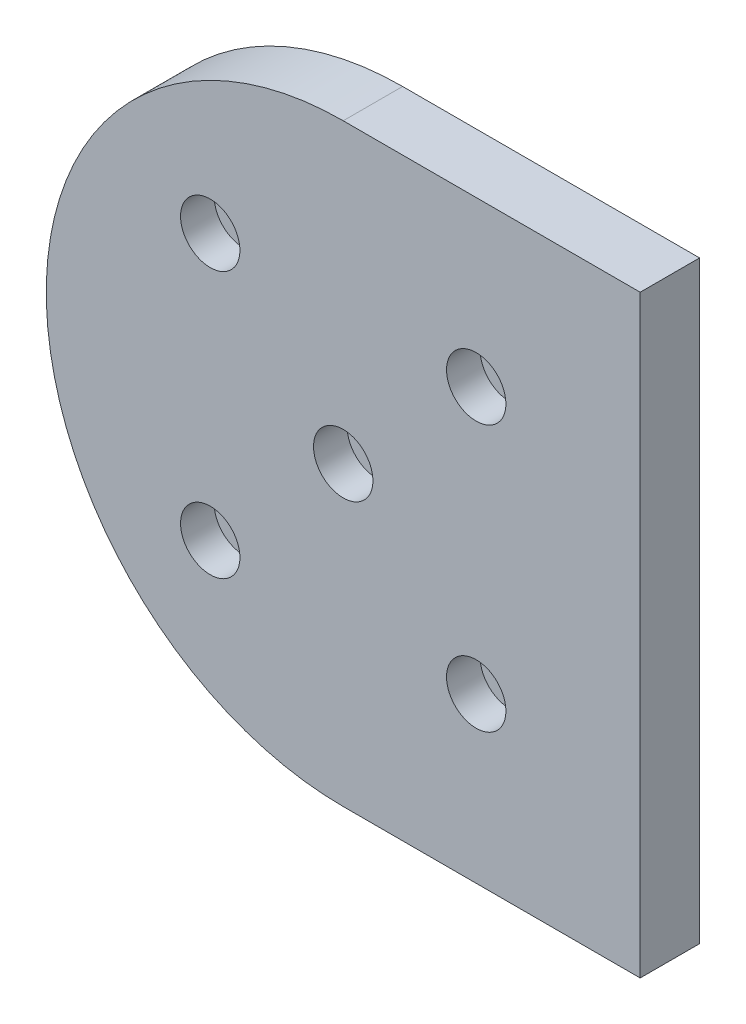
ISO-10303-21;
HEADER;
FILE_DESCRIPTION(('STEP AP214'),'2;1');
FILE_NAME('part.step','',(''),(''),'','','');
FILE_SCHEMA(('AUTOMOTIVE_DESIGN { 1 0 10303 214 1 1 1 1 }'));
ENDSEC;
DATA;
#1=APPLICATION_CONTEXT('core data for automotive mechanical design processes');
#2=APPLICATION_PROTOCOL_DEFINITION('international standard','automotive_design',2000,#1);
#3=PRODUCT_CONTEXT('',#1,'mechanical');
#4=PRODUCT('Part','Part','',(#3));
#5=PRODUCT_RELATED_PRODUCT_CATEGORY('part','',(#4));
#6=PRODUCT_DEFINITION_FORMATION('','',#4);
#7=PRODUCT_DEFINITION_CONTEXT('part definition',#1,'design');
#8=PRODUCT_DEFINITION('design','',#6,#7);
#9=PRODUCT_DEFINITION_SHAPE('','',#8);
#10=(LENGTH_UNIT() NAMED_UNIT(*) SI_UNIT(.MILLI.,.METRE.));
#11=(NAMED_UNIT(*) PLANE_ANGLE_UNIT() SI_UNIT($,.RADIAN.));
#12=(NAMED_UNIT(*) SI_UNIT($,.STERADIAN.) SOLID_ANGLE_UNIT());
#13=UNCERTAINTY_MEASURE_WITH_UNIT(LENGTH_MEASURE(1.E-05),#10,'distance_accuracy_value','');
#14=(GEOMETRIC_REPRESENTATION_CONTEXT(3) GLOBAL_UNCERTAINTY_ASSIGNED_CONTEXT((#13)) GLOBAL_UNIT_ASSIGNED_CONTEXT((#10,
#11,#12)) REPRESENTATION_CONTEXT('',''));
#15=CARTESIAN_POINT('',(0.,0.,0.));
#16=DIRECTION('',(0.,0.,1.));
#17=DIRECTION('',(1.,0.,0.));
#18=AXIS2_PLACEMENT_3D('',#15,#16,#17);
#19=CARTESIAN_POINT('',(30.,0.,6.));
#20=DIRECTION('',(1.,0.,0.));
#21=DIRECTION('',(0.,0.,-1.));
#22=AXIS2_PLACEMENT_3D('',#19,#20,#21);
#23=PLANE('',#22);
#24=DIRECTION('',(0.,-1.,0.));
#25=VECTOR('',#24,1.);
#26=CARTESIAN_POINT('',(30.,0.,0.));
#27=LINE('',#26,#25);
#28=CARTESIAN_POINT('',(30.,30.,0.));
#29=VERTEX_POINT('',#28);
#30=CARTESIAN_POINT('',(30.,-30.,0.));
#31=VERTEX_POINT('',#30);
#32=EDGE_CURVE('E107',#29,#31,#27,.T.);
#33=ORIENTED_EDGE('',*,*,#32,.F.);
#34=DIRECTION('',(0.,0.,-1.));
#35=VECTOR('',#34,1.);
#36=CARTESIAN_POINT('',(30.,30.,6.));
#37=LINE('',#36,#35);
#38=CARTESIAN_POINT('',(30.,30.,6.));
#39=VERTEX_POINT('',#38);
#40=EDGE_CURVE('E11',#39,#29,#37,.T.);
#41=ORIENTED_EDGE('',*,*,#40,.F.);
#42=DIRECTION('',(0.,-1.,0.));
#43=VECTOR('',#42,1.);
#44=CARTESIAN_POINT('',(30.,0.,6.));
#45=LINE('',#44,#43);
#46=CARTESIAN_POINT('',(30.,-30.,6.));
#47=VERTEX_POINT('',#46);
#48=EDGE_CURVE('E100',#39,#47,#45,.T.);
#49=ORIENTED_EDGE('',*,*,#48,.T.);
#50=DIRECTION('',(0.,0.,-1.));
#51=VECTOR('',#50,1.);
#52=CARTESIAN_POINT('',(30.,-30.,6.));
#53=LINE('',#52,#51);
#54=EDGE_CURVE('E81',#47,#31,#53,.T.);
#55=ORIENTED_EDGE('',*,*,#54,.T.);
#56=EDGE_LOOP('',(#33,#41,#49,#55));
#57=FACE_BOUND('',#56,.T.);
#58=ADVANCED_FACE('F43',(#57),#23,.T.);
#59=CARTESIAN_POINT('',(0.,30.,6.));
#60=DIRECTION('',(0.,1.,0.));
#61=DIRECTION('',(0.,0.,1.));
#62=AXIS2_PLACEMENT_3D('',#59,#60,#61);
#63=PLANE('',#62);
#64=DIRECTION('',(1.,0.,0.));
#65=VECTOR('',#64,1.);
#66=CARTESIAN_POINT('',(0.,30.,0.));
#67=LINE('',#66,#65);
#68=CARTESIAN_POINT('',(0.,30.,0.));
#69=VERTEX_POINT('',#68);
#70=EDGE_CURVE('E94',#69,#29,#67,.T.);
#71=ORIENTED_EDGE('',*,*,#70,.F.);
#72=DIRECTION('',(0.,0.,-1.));
#73=VECTOR('',#72,1.);
#74=CARTESIAN_POINT('',(0.,30.,6.));
#75=LINE('',#74,#73);
#76=CARTESIAN_POINT('',(0.,30.,6.));
#77=VERTEX_POINT('',#76);
#78=EDGE_CURVE('E51',#77,#69,#75,.T.);
#79=ORIENTED_EDGE('',*,*,#78,.F.);
#80=DIRECTION('',(1.,0.,0.));
#81=VECTOR('',#80,1.);
#82=CARTESIAN_POINT('',(0.,30.,6.));
#83=LINE('',#82,#81);
#84=EDGE_CURVE('E92',#77,#39,#83,.T.);
#85=ORIENTED_EDGE('',*,*,#84,.T.);
#86=ORIENTED_EDGE('',*,*,#40,.T.);
#87=EDGE_LOOP('',(#71,#79,#85,#86));
#88=FACE_BOUND('',#87,.T.);
#89=ADVANCED_FACE('F90',(#88),#63,.T.);
#90=CARTESIAN_POINT('',(0.,0.,6.));
#91=DIRECTION('',(0.,0.,-1.));
#92=DIRECTION('',(-1.,0.,0.));
#93=AXIS2_PLACEMENT_3D('',#90,#91,#92);
#94=CYLINDRICAL_SURFACE('',#93,30.);
#95=CARTESIAN_POINT('',(0.,0.,0.));
#96=DIRECTION('',(0.,0.,1.));
#97=DIRECTION('',(1.,0.,0.));
#98=AXIS2_PLACEMENT_3D('',#95,#96,#97);
#99=CIRCLE('',#98,30.);
#100=CARTESIAN_POINT('',(0.,-30.,0.));
#101=VERTEX_POINT('',#100);
#102=EDGE_CURVE('E74',#69,#101,#99,.T.);
#103=ORIENTED_EDGE('',*,*,#102,.T.);
#104=DIRECTION('',(0.,0.,-1.));
#105=VECTOR('',#104,1.);
#106=CARTESIAN_POINT('',(0.,-30.,6.));
#107=LINE('',#106,#105);
#108=CARTESIAN_POINT('',(0.,-30.,6.));
#109=VERTEX_POINT('',#108);
#110=EDGE_CURVE('E95',#109,#101,#107,.T.);
#111=ORIENTED_EDGE('',*,*,#110,.F.);
#112=CARTESIAN_POINT('',(0.,0.,6.));
#113=DIRECTION('',(0.,0.,1.));
#114=DIRECTION('',(1.,0.,0.));
#115=AXIS2_PLACEMENT_3D('',#112,#113,#114);
#116=CIRCLE('',#115,30.);
#117=EDGE_CURVE('E96',#77,#109,#116,.T.);
#118=ORIENTED_EDGE('',*,*,#117,.F.);
#119=ORIENTED_EDGE('',*,*,#78,.T.);
#120=EDGE_LOOP('',(#103,#111,#118,#119));
#121=FACE_BOUND('',#120,.T.);
#122=ADVANCED_FACE('F97',(#121),#94,.T.);
#123=CARTESIAN_POINT('',(0.,-30.,6.));
#124=DIRECTION('',(0.,1.,0.));
#125=DIRECTION('',(0.,0.,1.));
#126=AXIS2_PLACEMENT_3D('',#123,#124,#125);
#127=PLANE('',#126);
#128=DIRECTION('',(1.,0.,0.));
#129=VECTOR('',#128,1.);
#130=CARTESIAN_POINT('',(0.,-30.,0.));
#131=LINE('',#130,#129);
#132=EDGE_CURVE('E102',#101,#31,#131,.T.);
#133=ORIENTED_EDGE('',*,*,#132,.T.);
#134=ORIENTED_EDGE('',*,*,#54,.F.);
#135=DIRECTION('',(1.,0.,0.));
#136=VECTOR('',#135,1.);
#137=CARTESIAN_POINT('',(0.,-30.,6.));
#138=LINE('',#137,#136);
#139=EDGE_CURVE('E59',#109,#47,#138,.T.);
#140=ORIENTED_EDGE('',*,*,#139,.F.);
#141=ORIENTED_EDGE('',*,*,#110,.T.);
#142=EDGE_LOOP('',(#133,#134,#140,#141));
#143=FACE_BOUND('',#142,.T.);
#144=ADVANCED_FACE('F117',(#143),#127,.F.);
#145=CARTESIAN_POINT('',(0.,0.,6.));
#146=DIRECTION('',(0.,0.,1.));
#147=DIRECTION('',(1.,0.,0.));
#148=AXIS2_PLACEMENT_3D('',#145,#146,#147);
#149=PLANE('',#148);
#150=CARTESIAN_POINT('',(0.,0.,6.));
#151=DIRECTION('',(0.,0.,1.));
#152=DIRECTION('',(1.,0.,0.));
#153=AXIS2_PLACEMENT_3D('',#150,#151,#152);
#154=CIRCLE('',#153,3.);
#155=CARTESIAN_POINT('',(3.,0.,6.));
#156=VERTEX_POINT('',#155);
#157=EDGE_CURVE('E212',#156,#156,#154,.T.);
#158=ORIENTED_EDGE('',*,*,#157,.F.);
#159=EDGE_LOOP('',(#158));
#160=FACE_BOUND('',#159,.T.);
#161=CARTESIAN_POINT('',(13.4350288425444,-13.4350288425444,6.));
#162=DIRECTION('',(0.,0.,1.));
#163=DIRECTION('',(1.,0.,0.));
#164=AXIS2_PLACEMENT_3D('',#161,#162,#163);
#165=CIRCLE('',#164,3.);
#166=CARTESIAN_POINT('',(16.4350288425444,-13.4350288425444,6.));
#167=VERTEX_POINT('',#166);
#168=EDGE_CURVE('E222',#167,#167,#165,.T.);
#169=ORIENTED_EDGE('',*,*,#168,.F.);
#170=EDGE_LOOP('',(#169));
#171=FACE_BOUND('',#170,.T.);
#172=CARTESIAN_POINT('',(-13.4350288425444,13.4350288425444,6.));
#173=DIRECTION('',(0.,0.,1.));
#174=DIRECTION('',(1.,0.,0.));
#175=AXIS2_PLACEMENT_3D('',#172,#173,#174);
#176=CIRCLE('',#175,3.);
#177=CARTESIAN_POINT('',(-10.4350288425444,13.4350288425444,6.));
#178=VERTEX_POINT('',#177);
#179=EDGE_CURVE('E234',#178,#178,#176,.T.);
#180=ORIENTED_EDGE('',*,*,#179,.F.);
#181=EDGE_LOOP('',(#180));
#182=FACE_BOUND('',#181,.T.);
#183=CARTESIAN_POINT('',(-13.4350288425444,-13.4350288425444,6.));
#184=DIRECTION('',(0.,0.,1.));
#185=DIRECTION('',(1.,0.,0.));
#186=AXIS2_PLACEMENT_3D('',#183,#184,#185);
#187=CIRCLE('',#186,3.);
#188=CARTESIAN_POINT('',(-10.4350288425444,-13.4350288425444,6.));
#189=VERTEX_POINT('',#188);
#190=EDGE_CURVE('E246',#189,#189,#187,.T.);
#191=ORIENTED_EDGE('',*,*,#190,.F.);
#192=EDGE_LOOP('',(#191));
#193=FACE_BOUND('',#192,.T.);
#194=CARTESIAN_POINT('',(13.4350288425444,13.4350288425444,6.));
#195=DIRECTION('',(0.,0.,1.));
#196=DIRECTION('',(1.,0.,0.));
#197=AXIS2_PLACEMENT_3D('',#194,#195,#196);
#198=CIRCLE('',#197,2.99999999999999);
#199=CARTESIAN_POINT('',(16.4350288425444,13.4350288425444,6.));
#200=VERTEX_POINT('',#199);
#201=EDGE_CURVE('E258',#200,#200,#198,.T.);
#202=ORIENTED_EDGE('',*,*,#201,.F.);
#203=EDGE_LOOP('',(#202));
#204=FACE_BOUND('',#203,.T.);
#205=ORIENTED_EDGE('',*,*,#48,.F.);
#206=ORIENTED_EDGE('',*,*,#84,.F.);
#207=ORIENTED_EDGE('',*,*,#117,.T.);
#208=ORIENTED_EDGE('',*,*,#139,.T.);
#209=EDGE_LOOP('',(#205,#206,#207,#208));
#210=FACE_BOUND('',#209,.T.);
#211=ADVANCED_FACE('F99',(#160,#171,#182,#193,#204,#210),#149,.T.);
#212=CARTESIAN_POINT('',(0.,0.,0.));
#213=DIRECTION('',(0.,0.,1.));
#214=DIRECTION('',(1.,0.,0.));
#215=AXIS2_PLACEMENT_3D('',#212,#213,#214);
#216=PLANE('',#215);
#217=CARTESIAN_POINT('',(0.,0.,0.));
#218=DIRECTION('',(0.,0.,-1.));
#219=DIRECTION('',(-1.,0.,0.));
#220=AXIS2_PLACEMENT_3D('',#217,#218,#219);
#221=CIRCLE('',#220,28.5);
#222=CARTESIAN_POINT('',(-28.5,0.,0.));
#223=VERTEX_POINT('',#222);
#224=EDGE_CURVE('E270',#223,#223,#221,.T.);
#225=ORIENTED_EDGE('',*,*,#224,.F.);
#226=EDGE_LOOP('',(#225));
#227=FACE_BOUND('',#226,.T.);
#228=ORIENTED_EDGE('',*,*,#32,.T.);
#229=ORIENTED_EDGE('',*,*,#132,.F.);
#230=ORIENTED_EDGE('',*,*,#102,.F.);
#231=ORIENTED_EDGE('',*,*,#70,.T.);
#232=EDGE_LOOP('',(#228,#229,#230,#231));
#233=FACE_BOUND('',#232,.T.);
#234=ADVANCED_FACE('F119',(#227,#233),#216,.F.);
#235=CARTESIAN_POINT('',(0.,0.,1.));
#236=DIRECTION('',(0.,0.,-1.));
#237=DIRECTION('',(-1.,0.,0.));
#238=AXIS2_PLACEMENT_3D('',#235,#236,#237);
#239=CYLINDRICAL_SURFACE('',#238,28.5);
#240=CARTESIAN_POINT('',(0.,0.,1.));
#241=DIRECTION('',(0.,0.,-1.));
#242=DIRECTION('',(-1.,0.,0.));
#243=AXIS2_PLACEMENT_3D('',#240,#241,#242);
#244=CIRCLE('',#243,28.5);
#245=CARTESIAN_POINT('',(-28.5,0.,1.));
#246=VERTEX_POINT('',#245);
#247=EDGE_CURVE('E110',#246,#246,#244,.T.);
#248=ORIENTED_EDGE('',*,*,#247,.F.);
#249=EDGE_LOOP('',(#248));
#250=FACE_BOUND('',#249,.T.);
#251=ORIENTED_EDGE('',*,*,#224,.T.);
#252=EDGE_LOOP('',(#251));
#253=FACE_BOUND('',#252,.T.);
#254=ADVANCED_FACE('F133',(#250,#253),#239,.F.);
#255=CARTESIAN_POINT('',(0.,0.,1.));
#256=DIRECTION('',(0.,0.,-1.));
#257=DIRECTION('',(-1.,0.,0.));
#258=AXIS2_PLACEMENT_3D('',#255,#256,#257);
#259=PLANE('',#258);
#260=CARTESIAN_POINT('',(0.,0.,1.));
#261=DIRECTION('',(0.,0.,-1.));
#262=DIRECTION('',(-1.,0.,0.));
#263=AXIS2_PLACEMENT_3D('',#260,#261,#262);
#264=CIRCLE('',#263,1.7);
#265=CARTESIAN_POINT('',(-1.7,0.,1.));
#266=VERTEX_POINT('',#265);
#267=EDGE_CURVE('E219',#266,#266,#264,.T.);
#268=ORIENTED_EDGE('',*,*,#267,.F.);
#269=EDGE_LOOP('',(#268));
#270=FACE_BOUND('',#269,.T.);
#271=CARTESIAN_POINT('',(13.4350288425444,-13.4350288425444,1.));
#272=DIRECTION('',(0.,0.,-1.));
#273=DIRECTION('',(-1.,0.,0.));
#274=AXIS2_PLACEMENT_3D('',#271,#272,#273);
#275=CIRCLE('',#274,1.7);
#276=CARTESIAN_POINT('',(11.7350288425444,-13.4350288425444,1.));
#277=VERTEX_POINT('',#276);
#278=EDGE_CURVE('E231',#277,#277,#275,.T.);
#279=ORIENTED_EDGE('',*,*,#278,.F.);
#280=EDGE_LOOP('',(#279));
#281=FACE_BOUND('',#280,.T.);
#282=CARTESIAN_POINT('',(-13.4350288425444,13.4350288425444,1.));
#283=DIRECTION('',(0.,0.,-1.));
#284=DIRECTION('',(-1.,0.,0.));
#285=AXIS2_PLACEMENT_3D('',#282,#283,#284);
#286=CIRCLE('',#285,1.7);
#287=CARTESIAN_POINT('',(-15.1350288425444,13.4350288425444,1.));
#288=VERTEX_POINT('',#287);
#289=EDGE_CURVE('E243',#288,#288,#286,.T.);
#290=ORIENTED_EDGE('',*,*,#289,.F.);
#291=EDGE_LOOP('',(#290));
#292=FACE_BOUND('',#291,.T.);
#293=CARTESIAN_POINT('',(-13.4350288425444,-13.4350288425444,1.));
#294=DIRECTION('',(0.,0.,-1.));
#295=DIRECTION('',(-1.,0.,0.));
#296=AXIS2_PLACEMENT_3D('',#293,#294,#295);
#297=CIRCLE('',#296,1.7);
#298=CARTESIAN_POINT('',(-15.1350288425444,-13.4350288425444,1.));
#299=VERTEX_POINT('',#298);
#300=EDGE_CURVE('E255',#299,#299,#297,.T.);
#301=ORIENTED_EDGE('',*,*,#300,.F.);
#302=EDGE_LOOP('',(#301));
#303=FACE_BOUND('',#302,.T.);
#304=CARTESIAN_POINT('',(13.4350288425444,13.4350288425444,1.));
#305=DIRECTION('',(0.,0.,-1.));
#306=DIRECTION('',(-1.,0.,0.));
#307=AXIS2_PLACEMENT_3D('',#304,#305,#306);
#308=CIRCLE('',#307,1.7);
#309=CARTESIAN_POINT('',(11.7350288425444,13.4350288425444,1.));
#310=VERTEX_POINT('',#309);
#311=EDGE_CURVE('E267',#310,#310,#308,.T.);
#312=ORIENTED_EDGE('',*,*,#311,.F.);
#313=EDGE_LOOP('',(#312));
#314=FACE_BOUND('',#313,.T.);
#315=ORIENTED_EDGE('',*,*,#247,.T.);
#316=EDGE_LOOP('',(#315));
#317=FACE_BOUND('',#316,.T.);
#318=ADVANCED_FACE('F140',(#270,#281,#292,#303,#314,#317),#259,.T.);
#319=CARTESIAN_POINT('',(13.4350288425444,13.4350288425444,6.));
#320=DIRECTION('',(0.,0.,1.));
#321=DIRECTION('',(1.,0.,0.));
#322=AXIS2_PLACEMENT_3D('',#319,#320,#321);
#323=CYLINDRICAL_SURFACE('',#322,1.7);
#324=CARTESIAN_POINT('',(13.4350288425444,13.4350288425444,2.6));
#325=DIRECTION('',(0.,0.,1.));
#326=DIRECTION('',(1.,0.,0.));
#327=AXIS2_PLACEMENT_3D('',#324,#325,#326);
#328=CIRCLE('',#327,1.7);
#329=CARTESIAN_POINT('',(15.1350288425444,13.4350288425444,2.6));
#330=VERTEX_POINT('',#329);
#331=EDGE_CURVE('E264',#330,#330,#328,.T.);
#332=ORIENTED_EDGE('',*,*,#331,.T.);
#333=EDGE_LOOP('',(#332));
#334=FACE_BOUND('',#333,.T.);
#335=ORIENTED_EDGE('',*,*,#311,.T.);
#336=EDGE_LOOP('',(#335));
#337=FACE_BOUND('',#336,.T.);
#338=ADVANCED_FACE('F144',(#334,#337),#323,.F.);
#339=CARTESIAN_POINT('',(15.1350288425444,13.4350288425444,2.6));
#340=DIRECTION('',(0.,0.,-1.));
#341=DIRECTION('',(-1.,0.,0.));
#342=AXIS2_PLACEMENT_3D('',#339,#340,#341);
#343=PLANE('',#342);
#344=ORIENTED_EDGE('',*,*,#331,.F.);
#345=EDGE_LOOP('',(#344));
#346=FACE_BOUND('',#345,.T.);
#347=CARTESIAN_POINT('',(13.4350288425444,13.4350288425444,2.6));
#348=DIRECTION('',(0.,0.,1.));
#349=DIRECTION('',(1.,0.,0.));
#350=AXIS2_PLACEMENT_3D('',#347,#348,#349);
#351=CIRCLE('',#350,2.99999999999999);
#352=CARTESIAN_POINT('',(16.4350288425444,13.4350288425444,2.6));
#353=VERTEX_POINT('',#352);
#354=EDGE_CURVE('E261',#353,#353,#351,.T.);
#355=ORIENTED_EDGE('',*,*,#354,.T.);
#356=EDGE_LOOP('',(#355));
#357=FACE_BOUND('',#356,.T.);
#358=ADVANCED_FACE('F148',(#346,#357),#343,.F.);
#359=CARTESIAN_POINT('',(13.4350288425444,13.4350288425444,6.));
#360=DIRECTION('',(0.,0.,1.));
#361=DIRECTION('',(1.,0.,0.));
#362=AXIS2_PLACEMENT_3D('',#359,#360,#361);
#363=CYLINDRICAL_SURFACE('',#362,2.99999999999999);
#364=ORIENTED_EDGE('',*,*,#354,.F.);
#365=EDGE_LOOP('',(#364));
#366=FACE_BOUND('',#365,.T.);
#367=ORIENTED_EDGE('',*,*,#201,.T.);
#368=EDGE_LOOP('',(#367));
#369=FACE_BOUND('',#368,.T.);
#370=ADVANCED_FACE('F152',(#366,#369),#363,.F.);
#371=CARTESIAN_POINT('',(-13.4350288425444,-13.4350288425444,6.));
#372=DIRECTION('',(0.,0.,1.));
#373=DIRECTION('',(1.,0.,0.));
#374=AXIS2_PLACEMENT_3D('',#371,#372,#373);
#375=CYLINDRICAL_SURFACE('',#374,1.7);
#376=CARTESIAN_POINT('',(-13.4350288425444,-13.4350288425444,2.6));
#377=DIRECTION('',(0.,0.,1.));
#378=DIRECTION('',(1.,0.,0.));
#379=AXIS2_PLACEMENT_3D('',#376,#377,#378);
#380=CIRCLE('',#379,1.7);
#381=CARTESIAN_POINT('',(-11.7350288425444,-13.4350288425444,2.6));
#382=VERTEX_POINT('',#381);
#383=EDGE_CURVE('E252',#382,#382,#380,.T.);
#384=ORIENTED_EDGE('',*,*,#383,.T.);
#385=EDGE_LOOP('',(#384));
#386=FACE_BOUND('',#385,.T.);
#387=ORIENTED_EDGE('',*,*,#300,.T.);
#388=EDGE_LOOP('',(#387));
#389=FACE_BOUND('',#388,.T.);
#390=ADVANCED_FACE('F156',(#386,#389),#375,.F.);
#391=CARTESIAN_POINT('',(-11.7350288425444,-13.4350288425444,2.6));
#392=DIRECTION('',(0.,0.,-1.));
#393=DIRECTION('',(-1.,0.,0.));
#394=AXIS2_PLACEMENT_3D('',#391,#392,#393);
#395=PLANE('',#394);
#396=ORIENTED_EDGE('',*,*,#383,.F.);
#397=EDGE_LOOP('',(#396));
#398=FACE_BOUND('',#397,.T.);
#399=CARTESIAN_POINT('',(-13.4350288425444,-13.4350288425444,2.6));
#400=DIRECTION('',(0.,0.,1.));
#401=DIRECTION('',(1.,0.,0.));
#402=AXIS2_PLACEMENT_3D('',#399,#400,#401);
#403=CIRCLE('',#402,3.);
#404=CARTESIAN_POINT('',(-10.4350288425444,-13.4350288425444,2.6));
#405=VERTEX_POINT('',#404);
#406=EDGE_CURVE('E249',#405,#405,#403,.T.);
#407=ORIENTED_EDGE('',*,*,#406,.T.);
#408=EDGE_LOOP('',(#407));
#409=FACE_BOUND('',#408,.T.);
#410=ADVANCED_FACE('F160',(#398,#409),#395,.F.);
#411=CARTESIAN_POINT('',(-13.4350288425444,-13.4350288425444,6.));
#412=DIRECTION('',(0.,0.,1.));
#413=DIRECTION('',(1.,0.,0.));
#414=AXIS2_PLACEMENT_3D('',#411,#412,#413);
#415=CYLINDRICAL_SURFACE('',#414,3.);
#416=ORIENTED_EDGE('',*,*,#406,.F.);
#417=EDGE_LOOP('',(#416));
#418=FACE_BOUND('',#417,.T.);
#419=ORIENTED_EDGE('',*,*,#190,.T.);
#420=EDGE_LOOP('',(#419));
#421=FACE_BOUND('',#420,.T.);
#422=ADVANCED_FACE('F164',(#418,#421),#415,.F.);
#423=CARTESIAN_POINT('',(-13.4350288425444,13.4350288425444,6.));
#424=DIRECTION('',(0.,0.,1.));
#425=DIRECTION('',(1.,0.,0.));
#426=AXIS2_PLACEMENT_3D('',#423,#424,#425);
#427=CYLINDRICAL_SURFACE('',#426,1.7);
#428=CARTESIAN_POINT('',(-13.4350288425444,13.4350288425444,2.6));
#429=DIRECTION('',(0.,0.,1.));
#430=DIRECTION('',(1.,0.,0.));
#431=AXIS2_PLACEMENT_3D('',#428,#429,#430);
#432=CIRCLE('',#431,1.7);
#433=CARTESIAN_POINT('',(-11.7350288425444,13.4350288425444,2.6));
#434=VERTEX_POINT('',#433);
#435=EDGE_CURVE('E240',#434,#434,#432,.T.);
#436=ORIENTED_EDGE('',*,*,#435,.T.);
#437=EDGE_LOOP('',(#436));
#438=FACE_BOUND('',#437,.T.);
#439=ORIENTED_EDGE('',*,*,#289,.T.);
#440=EDGE_LOOP('',(#439));
#441=FACE_BOUND('',#440,.T.);
#442=ADVANCED_FACE('F168',(#438,#441),#427,.F.);
#443=CARTESIAN_POINT('',(-11.7350288425444,13.4350288425444,2.6));
#444=DIRECTION('',(0.,0.,-1.));
#445=DIRECTION('',(-1.,0.,0.));
#446=AXIS2_PLACEMENT_3D('',#443,#444,#445);
#447=PLANE('',#446);
#448=ORIENTED_EDGE('',*,*,#435,.F.);
#449=EDGE_LOOP('',(#448));
#450=FACE_BOUND('',#449,.T.);
#451=CARTESIAN_POINT('',(-13.4350288425444,13.4350288425444,2.6));
#452=DIRECTION('',(0.,0.,1.));
#453=DIRECTION('',(1.,0.,0.));
#454=AXIS2_PLACEMENT_3D('',#451,#452,#453);
#455=CIRCLE('',#454,3.);
#456=CARTESIAN_POINT('',(-10.4350288425444,13.4350288425444,2.6));
#457=VERTEX_POINT('',#456);
#458=EDGE_CURVE('E237',#457,#457,#455,.T.);
#459=ORIENTED_EDGE('',*,*,#458,.T.);
#460=EDGE_LOOP('',(#459));
#461=FACE_BOUND('',#460,.T.);
#462=ADVANCED_FACE('F172',(#450,#461),#447,.F.);
#463=CARTESIAN_POINT('',(-13.4350288425444,13.4350288425444,6.));
#464=DIRECTION('',(0.,0.,1.));
#465=DIRECTION('',(1.,0.,0.));
#466=AXIS2_PLACEMENT_3D('',#463,#464,#465);
#467=CYLINDRICAL_SURFACE('',#466,3.);
#468=ORIENTED_EDGE('',*,*,#458,.F.);
#469=EDGE_LOOP('',(#468));
#470=FACE_BOUND('',#469,.T.);
#471=ORIENTED_EDGE('',*,*,#179,.T.);
#472=EDGE_LOOP('',(#471));
#473=FACE_BOUND('',#472,.T.);
#474=ADVANCED_FACE('F176',(#470,#473),#467,.F.);
#475=CARTESIAN_POINT('',(13.4350288425444,-13.4350288425444,6.));
#476=DIRECTION('',(0.,0.,1.));
#477=DIRECTION('',(1.,0.,0.));
#478=AXIS2_PLACEMENT_3D('',#475,#476,#477);
#479=CYLINDRICAL_SURFACE('',#478,1.7);
#480=CARTESIAN_POINT('',(13.4350288425444,-13.4350288425444,2.6));
#481=DIRECTION('',(0.,0.,1.));
#482=DIRECTION('',(1.,0.,0.));
#483=AXIS2_PLACEMENT_3D('',#480,#481,#482);
#484=CIRCLE('',#483,1.7);
#485=CARTESIAN_POINT('',(15.1350288425444,-13.4350288425444,2.6));
#486=VERTEX_POINT('',#485);
#487=EDGE_CURVE('E228',#486,#486,#484,.T.);
#488=ORIENTED_EDGE('',*,*,#487,.T.);
#489=EDGE_LOOP('',(#488));
#490=FACE_BOUND('',#489,.T.);
#491=ORIENTED_EDGE('',*,*,#278,.T.);
#492=EDGE_LOOP('',(#491));
#493=FACE_BOUND('',#492,.T.);
#494=ADVANCED_FACE('F180',(#490,#493),#479,.F.);
#495=CARTESIAN_POINT('',(15.1350288425444,-13.4350288425444,2.6));
#496=DIRECTION('',(0.,0.,-1.));
#497=DIRECTION('',(-1.,0.,0.));
#498=AXIS2_PLACEMENT_3D('',#495,#496,#497);
#499=PLANE('',#498);
#500=ORIENTED_EDGE('',*,*,#487,.F.);
#501=EDGE_LOOP('',(#500));
#502=FACE_BOUND('',#501,.T.);
#503=CARTESIAN_POINT('',(13.4350288425444,-13.4350288425444,2.6));
#504=DIRECTION('',(0.,0.,1.));
#505=DIRECTION('',(1.,0.,0.));
#506=AXIS2_PLACEMENT_3D('',#503,#504,#505);
#507=CIRCLE('',#506,3.);
#508=CARTESIAN_POINT('',(16.4350288425444,-13.4350288425444,2.6));
#509=VERTEX_POINT('',#508);
#510=EDGE_CURVE('E225',#509,#509,#507,.T.);
#511=ORIENTED_EDGE('',*,*,#510,.T.);
#512=EDGE_LOOP('',(#511));
#513=FACE_BOUND('',#512,.T.);
#514=ADVANCED_FACE('F184',(#502,#513),#499,.F.);
#515=CARTESIAN_POINT('',(13.4350288425444,-13.4350288425444,6.));
#516=DIRECTION('',(0.,0.,1.));
#517=DIRECTION('',(1.,0.,0.));
#518=AXIS2_PLACEMENT_3D('',#515,#516,#517);
#519=CYLINDRICAL_SURFACE('',#518,3.);
#520=ORIENTED_EDGE('',*,*,#510,.F.);
#521=EDGE_LOOP('',(#520));
#522=FACE_BOUND('',#521,.T.);
#523=ORIENTED_EDGE('',*,*,#168,.T.);
#524=EDGE_LOOP('',(#523));
#525=FACE_BOUND('',#524,.T.);
#526=ADVANCED_FACE('F188',(#522,#525),#519,.F.);
#527=CARTESIAN_POINT('',(0.,0.,6.));
#528=DIRECTION('',(0.,0.,1.));
#529=DIRECTION('',(1.,0.,0.));
#530=AXIS2_PLACEMENT_3D('',#527,#528,#529);
#531=CYLINDRICAL_SURFACE('',#530,1.7);
#532=CARTESIAN_POINT('',(0.,0.,2.6));
#533=DIRECTION('',(0.,0.,1.));
#534=DIRECTION('',(1.,0.,0.));
#535=AXIS2_PLACEMENT_3D('',#532,#533,#534);
#536=CIRCLE('',#535,1.7);
#537=CARTESIAN_POINT('',(1.7,0.,2.6));
#538=VERTEX_POINT('',#537);
#539=EDGE_CURVE('E214',#538,#538,#536,.T.);
#540=ORIENTED_EDGE('',*,*,#539,.T.);
#541=EDGE_LOOP('',(#540));
#542=FACE_BOUND('',#541,.T.);
#543=ORIENTED_EDGE('',*,*,#267,.T.);
#544=EDGE_LOOP('',(#543));
#545=FACE_BOUND('',#544,.T.);
#546=ADVANCED_FACE('F192',(#542,#545),#531,.F.);
#547=CARTESIAN_POINT('',(1.7,0.,2.6));
#548=DIRECTION('',(0.,0.,-1.));
#549=DIRECTION('',(-1.,0.,0.));
#550=AXIS2_PLACEMENT_3D('',#547,#548,#549);
#551=PLANE('',#550);
#552=ORIENTED_EDGE('',*,*,#539,.F.);
#553=EDGE_LOOP('',(#552));
#554=FACE_BOUND('',#553,.T.);
#555=CARTESIAN_POINT('',(0.,0.,2.6));
#556=DIRECTION('',(0.,0.,1.));
#557=DIRECTION('',(1.,0.,0.));
#558=AXIS2_PLACEMENT_3D('',#555,#556,#557);
#559=CIRCLE('',#558,3.);
#560=CARTESIAN_POINT('',(3.,0.,2.6));
#561=VERTEX_POINT('',#560);
#562=EDGE_CURVE('E209',#561,#561,#559,.T.);
#563=ORIENTED_EDGE('',*,*,#562,.T.);
#564=EDGE_LOOP('',(#563));
#565=FACE_BOUND('',#564,.T.);
#566=ADVANCED_FACE('F196',(#554,#565),#551,.F.);
#567=CARTESIAN_POINT('',(0.,0.,6.));
#568=DIRECTION('',(0.,0.,1.));
#569=DIRECTION('',(1.,0.,0.));
#570=AXIS2_PLACEMENT_3D('',#567,#568,#569);
#571=CYLINDRICAL_SURFACE('',#570,3.);
#572=ORIENTED_EDGE('',*,*,#562,.F.);
#573=EDGE_LOOP('',(#572));
#574=FACE_BOUND('',#573,.T.);
#575=ORIENTED_EDGE('',*,*,#157,.T.);
#576=EDGE_LOOP('',(#575));
#577=FACE_BOUND('',#576,.T.);
#578=ADVANCED_FACE('F200',(#574,#577),#571,.F.);
#579=CLOSED_SHELL('',(#58,#89,#122,#144,#211,#234,#254,#318,#338,#358,#370,#390,#410,#422,#442,
#462,#474,#494,#514,#526,#546,#566,#578));
#580=MANIFOLD_SOLID_BREP('B2',#579);
#581=ADVANCED_BREP_SHAPE_REPRESENTATION('',(#18,#580),#14);
#582=SHAPE_DEFINITION_REPRESENTATION(#9,#581);
ENDSEC;
END-ISO-10303-21;
